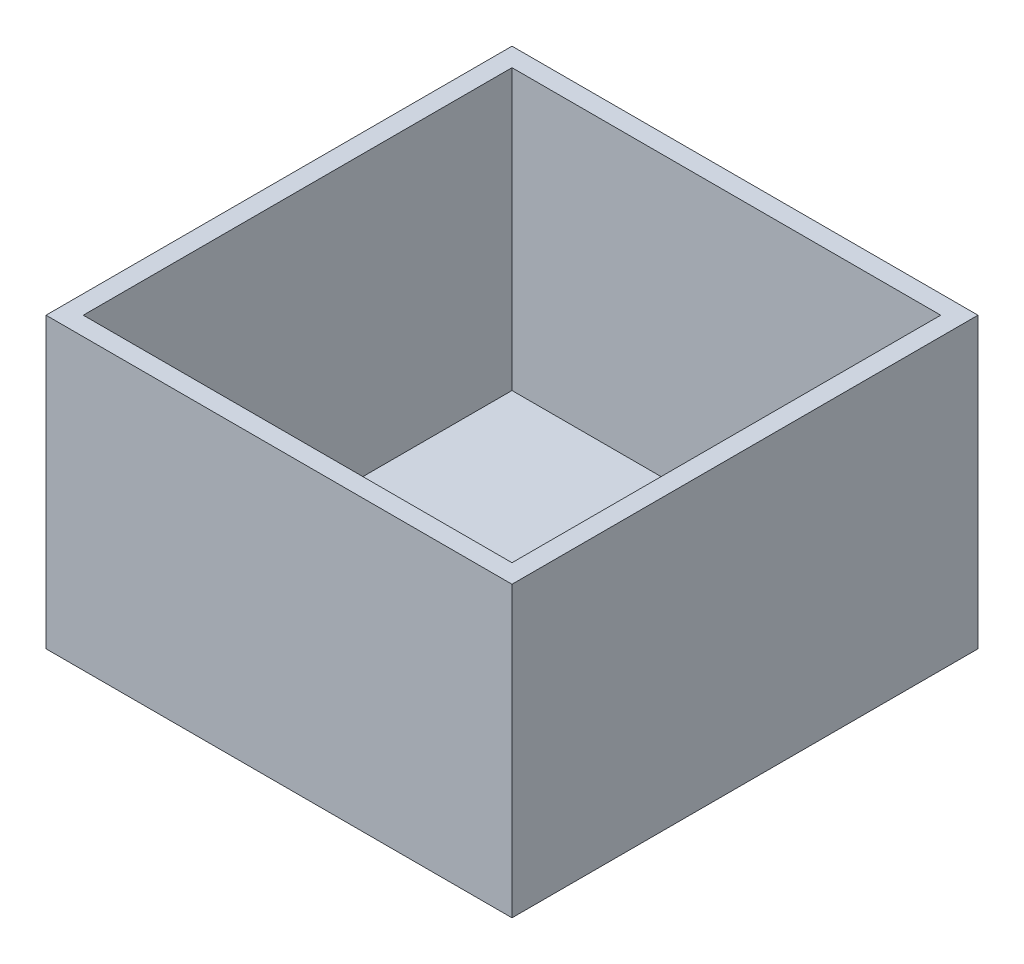
ISO-10303-21;
HEADER;
FILE_DESCRIPTION(('STEP AP214'),'2;1');
FILE_NAME('part.step','',(''),(''),'','','');
FILE_SCHEMA(('AUTOMOTIVE_DESIGN { 1 0 10303 214 1 1 1 1 }'));
ENDSEC;
DATA;
#1=APPLICATION_CONTEXT('core data for automotive mechanical design processes');
#2=APPLICATION_PROTOCOL_DEFINITION('international standard','automotive_design',2000,#1);
#3=PRODUCT_CONTEXT('',#1,'mechanical');
#4=PRODUCT('Part','Part','',(#3));
#5=PRODUCT_RELATED_PRODUCT_CATEGORY('part','',(#4));
#6=PRODUCT_DEFINITION_FORMATION('','',#4);
#7=PRODUCT_DEFINITION_CONTEXT('part definition',#1,'design');
#8=PRODUCT_DEFINITION('design','',#6,#7);
#9=PRODUCT_DEFINITION_SHAPE('','',#8);
#10=(LENGTH_UNIT() NAMED_UNIT(*) SI_UNIT(.MILLI.,.METRE.));
#11=(NAMED_UNIT(*) PLANE_ANGLE_UNIT() SI_UNIT($,.RADIAN.));
#12=(NAMED_UNIT(*) SI_UNIT($,.STERADIAN.) SOLID_ANGLE_UNIT());
#13=UNCERTAINTY_MEASURE_WITH_UNIT(LENGTH_MEASURE(1.E-05),#10,'distance_accuracy_value','');
#14=(GEOMETRIC_REPRESENTATION_CONTEXT(3) GLOBAL_UNCERTAINTY_ASSIGNED_CONTEXT((#13)) GLOBAL_UNIT_ASSIGNED_CONTEXT((#10,
#11,#12)) REPRESENTATION_CONTEXT('',''));
#15=CARTESIAN_POINT('',(0.,0.,0.));
#16=DIRECTION('',(0.,0.,1.));
#17=DIRECTION('',(1.,0.,0.));
#18=AXIS2_PLACEMENT_3D('',#15,#16,#17);
#19=CARTESIAN_POINT('',(0.,30.,0.));
#20=DIRECTION('',(0.,-1.,0.));
#21=DIRECTION('',(0.,0.,-1.));
#22=AXIS2_PLACEMENT_3D('',#19,#20,#21);
#23=PLANE('',#22);
#24=DIRECTION('',(0.,0.,-1.));
#25=VECTOR('',#24,1.);
#26=CARTESIAN_POINT('',(25.,30.,25.));
#27=LINE('',#26,#25);
#28=CARTESIAN_POINT('',(25.,30.,25.));
#29=VERTEX_POINT('',#28);
#30=CARTESIAN_POINT('',(25.,30.,-25.));
#31=VERTEX_POINT('',#30);
#32=EDGE_CURVE('E112',#29,#31,#27,.T.);
#33=ORIENTED_EDGE('',*,*,#32,.T.);
#34=DIRECTION('',(-1.,0.,0.));
#35=VECTOR('',#34,1.);
#36=CARTESIAN_POINT('',(-25.,30.,-25.));
#37=LINE('',#36,#35);
#38=CARTESIAN_POINT('',(-25.,30.,-25.));
#39=VERTEX_POINT('',#38);
#40=EDGE_CURVE('E161',#31,#39,#37,.T.);
#41=ORIENTED_EDGE('',*,*,#40,.T.);
#42=DIRECTION('',(0.,0.,1.));
#43=VECTOR('',#42,1.);
#44=CARTESIAN_POINT('',(-25.,30.,25.));
#45=LINE('',#44,#43);
#46=CARTESIAN_POINT('',(-25.,30.,25.));
#47=VERTEX_POINT('',#46);
#48=EDGE_CURVE('E163',#39,#47,#45,.T.);
#49=ORIENTED_EDGE('',*,*,#48,.T.);
#50=DIRECTION('',(1.,0.,0.));
#51=VECTOR('',#50,1.);
#52=CARTESIAN_POINT('',(-25.,30.,25.));
#53=LINE('',#52,#51);
#54=EDGE_CURVE('E116',#47,#29,#53,.T.);
#55=ORIENTED_EDGE('',*,*,#54,.T.);
#56=EDGE_LOOP('',(#33,#41,#49,#55));
#57=FACE_BOUND('',#56,.T.);
#58=DIRECTION('',(0.,0.,1.));
#59=VECTOR('',#58,1.);
#60=CARTESIAN_POINT('',(-23.,30.,23.));
#61=LINE('',#60,#59);
#62=CARTESIAN_POINT('',(-23.,30.,-23.));
#63=VERTEX_POINT('',#62);
#64=CARTESIAN_POINT('',(-23.,30.,23.));
#65=VERTEX_POINT('',#64);
#66=EDGE_CURVE('E135',#63,#65,#61,.T.);
#67=ORIENTED_EDGE('',*,*,#66,.F.);
#68=DIRECTION('',(-1.,0.,0.));
#69=VECTOR('',#68,1.);
#70=CARTESIAN_POINT('',(-23.,30.,-23.));
#71=LINE('',#70,#69);
#72=CARTESIAN_POINT('',(23.,30.,-23.));
#73=VERTEX_POINT('',#72);
#74=EDGE_CURVE('E142',#73,#63,#71,.T.);
#75=ORIENTED_EDGE('',*,*,#74,.F.);
#76=DIRECTION('',(0.,0.,-1.));
#77=VECTOR('',#76,1.);
#78=CARTESIAN_POINT('',(23.,30.,23.));
#79=LINE('',#78,#77);
#80=CARTESIAN_POINT('',(23.,30.,23.));
#81=VERTEX_POINT('',#80);
#82=EDGE_CURVE('E140',#81,#73,#79,.T.);
#83=ORIENTED_EDGE('',*,*,#82,.F.);
#84=DIRECTION('',(1.,0.,0.));
#85=VECTOR('',#84,1.);
#86=CARTESIAN_POINT('',(-23.,30.,23.));
#87=LINE('',#86,#85);
#88=EDGE_CURVE('E137',#65,#81,#87,.T.);
#89=ORIENTED_EDGE('',*,*,#88,.F.);
#90=EDGE_LOOP('',(#67,#75,#83,#89));
#91=FACE_BOUND('',#90,.T.);
#92=ADVANCED_FACE('F39',(#57,#91),#23,.F.);
#93=CARTESIAN_POINT('',(25.,30.,25.));
#94=DIRECTION('',(-1.,0.,0.));
#95=DIRECTION('',(0.,0.,1.));
#96=AXIS2_PLACEMENT_3D('',#93,#94,#95);
#97=PLANE('',#96);
#98=DIRECTION('',(0.,-1.,0.));
#99=VECTOR('',#98,1.);
#100=CARTESIAN_POINT('',(25.,30.,25.));
#101=LINE('',#100,#99);
#102=CARTESIAN_POINT('',(25.,-1.,25.));
#103=VERTEX_POINT('',#102);
#104=EDGE_CURVE('E106',#29,#103,#101,.T.);
#105=ORIENTED_EDGE('',*,*,#104,.T.);
#106=DIRECTION('',(0.,0.,1.));
#107=VECTOR('',#106,1.);
#108=CARTESIAN_POINT('',(25.,-1.,-25.));
#109=LINE('',#108,#107);
#110=CARTESIAN_POINT('',(25.,-1.,-25.));
#111=VERTEX_POINT('',#110);
#112=EDGE_CURVE('E110',#111,#103,#109,.T.);
#113=ORIENTED_EDGE('',*,*,#112,.F.);
#114=DIRECTION('',(0.,-1.,0.));
#115=VECTOR('',#114,1.);
#116=CARTESIAN_POINT('',(25.,30.,-25.));
#117=LINE('',#116,#115);
#118=EDGE_CURVE('E11',#31,#111,#117,.T.);
#119=ORIENTED_EDGE('',*,*,#118,.F.);
#120=ORIENTED_EDGE('',*,*,#32,.F.);
#121=EDGE_LOOP('',(#105,#113,#119,#120));
#122=FACE_BOUND('',#121,.T.);
#123=ADVANCED_FACE('F41',(#122),#97,.F.);
#124=CARTESIAN_POINT('',(-25.,30.,-25.));
#125=DIRECTION('',(0.,0.,1.));
#126=DIRECTION('',(1.,0.,0.));
#127=AXIS2_PLACEMENT_3D('',#124,#125,#126);
#128=PLANE('',#127);
#129=ORIENTED_EDGE('',*,*,#118,.T.);
#130=DIRECTION('',(1.,0.,0.));
#131=VECTOR('',#130,1.);
#132=CARTESIAN_POINT('',(-25.,-1.,-25.));
#133=LINE('',#132,#131);
#134=CARTESIAN_POINT('',(-25.,-1.,-25.));
#135=VERTEX_POINT('',#134);
#136=EDGE_CURVE('E130',#135,#111,#133,.T.);
#137=ORIENTED_EDGE('',*,*,#136,.F.);
#138=DIRECTION('',(0.,-1.,0.));
#139=VECTOR('',#138,1.);
#140=CARTESIAN_POINT('',(-25.,30.,-25.));
#141=LINE('',#140,#139);
#142=EDGE_CURVE('E47',#39,#135,#141,.T.);
#143=ORIENTED_EDGE('',*,*,#142,.F.);
#144=ORIENTED_EDGE('',*,*,#40,.F.);
#145=EDGE_LOOP('',(#129,#137,#143,#144));
#146=FACE_BOUND('',#145,.T.);
#147=ADVANCED_FACE('F171',(#146),#128,.F.);
#148=CARTESIAN_POINT('',(-25.,30.,25.));
#149=DIRECTION('',(1.,0.,0.));
#150=DIRECTION('',(0.,0.,-1.));
#151=AXIS2_PLACEMENT_3D('',#148,#149,#150);
#152=PLANE('',#151);
#153=ORIENTED_EDGE('',*,*,#142,.T.);
#154=DIRECTION('',(0.,0.,-1.));
#155=VECTOR('',#154,1.);
#156=CARTESIAN_POINT('',(-25.,-1.,-25.));
#157=LINE('',#156,#155);
#158=CARTESIAN_POINT('',(-25.,-1.,25.));
#159=VERTEX_POINT('',#158);
#160=EDGE_CURVE('E125',#159,#135,#157,.T.);
#161=ORIENTED_EDGE('',*,*,#160,.F.);
#162=DIRECTION('',(0.,-1.,0.));
#163=VECTOR('',#162,1.);
#164=CARTESIAN_POINT('',(-25.,30.,25.));
#165=LINE('',#164,#163);
#166=EDGE_CURVE('E115',#47,#159,#165,.T.);
#167=ORIENTED_EDGE('',*,*,#166,.F.);
#168=ORIENTED_EDGE('',*,*,#48,.F.);
#169=EDGE_LOOP('',(#153,#161,#167,#168));
#170=FACE_BOUND('',#169,.T.);
#171=ADVANCED_FACE('F169',(#170),#152,.F.);
#172=CARTESIAN_POINT('',(-25.,30.,25.));
#173=DIRECTION('',(0.,0.,-1.));
#174=DIRECTION('',(-1.,0.,0.));
#175=AXIS2_PLACEMENT_3D('',#172,#173,#174);
#176=PLANE('',#175);
#177=ORIENTED_EDGE('',*,*,#166,.T.);
#178=DIRECTION('',(-1.,0.,0.));
#179=VECTOR('',#178,1.);
#180=CARTESIAN_POINT('',(-25.,-1.,25.));
#181=LINE('',#180,#179);
#182=EDGE_CURVE('E119',#103,#159,#181,.T.);
#183=ORIENTED_EDGE('',*,*,#182,.F.);
#184=ORIENTED_EDGE('',*,*,#104,.F.);
#185=ORIENTED_EDGE('',*,*,#54,.F.);
#186=EDGE_LOOP('',(#177,#183,#184,#185));
#187=FACE_BOUND('',#186,.T.);
#188=ADVANCED_FACE('F120',(#187),#176,.F.);
#189=CARTESIAN_POINT('',(-23.,30.,23.));
#190=DIRECTION('',(1.,0.,0.));
#191=DIRECTION('',(0.,0.,-1.));
#192=AXIS2_PLACEMENT_3D('',#189,#190,#191);
#193=PLANE('',#192);
#194=DIRECTION('',(0.,0.,1.));
#195=VECTOR('',#194,1.);
#196=CARTESIAN_POINT('',(-23.,0.,23.));
#197=LINE('',#196,#195);
#198=CARTESIAN_POINT('',(-23.,0.,-23.));
#199=VERTEX_POINT('',#198);
#200=CARTESIAN_POINT('',(-23.,0.,23.));
#201=VERTEX_POINT('',#200);
#202=EDGE_CURVE('E62',#199,#201,#197,.T.);
#203=ORIENTED_EDGE('',*,*,#202,.F.);
#204=DIRECTION('',(0.,-1.,0.));
#205=VECTOR('',#204,1.);
#206=CARTESIAN_POINT('',(-23.,30.,-23.));
#207=LINE('',#206,#205);
#208=EDGE_CURVE('E144',#63,#199,#207,.T.);
#209=ORIENTED_EDGE('',*,*,#208,.F.);
#210=ORIENTED_EDGE('',*,*,#66,.T.);
#211=DIRECTION('',(0.,-1.,0.));
#212=VECTOR('',#211,1.);
#213=CARTESIAN_POINT('',(-23.,30.,23.));
#214=LINE('',#213,#212);
#215=EDGE_CURVE('E158',#65,#201,#214,.T.);
#216=ORIENTED_EDGE('',*,*,#215,.T.);
#217=EDGE_LOOP('',(#203,#209,#210,#216));
#218=FACE_BOUND('',#217,.T.);
#219=ADVANCED_FACE('F181',(#218),#193,.T.);
#220=CARTESIAN_POINT('',(-23.,30.,23.));
#221=DIRECTION('',(0.,0.,-1.));
#222=DIRECTION('',(-1.,0.,0.));
#223=AXIS2_PLACEMENT_3D('',#220,#221,#222);
#224=PLANE('',#223);
#225=DIRECTION('',(1.,0.,0.));
#226=VECTOR('',#225,1.);
#227=CARTESIAN_POINT('',(-23.,0.,23.));
#228=LINE('',#227,#226);
#229=CARTESIAN_POINT('',(23.,0.,23.));
#230=VERTEX_POINT('',#229);
#231=EDGE_CURVE('E146',#201,#230,#228,.T.);
#232=ORIENTED_EDGE('',*,*,#231,.F.);
#233=ORIENTED_EDGE('',*,*,#215,.F.);
#234=ORIENTED_EDGE('',*,*,#88,.T.);
#235=DIRECTION('',(0.,-1.,0.));
#236=VECTOR('',#235,1.);
#237=CARTESIAN_POINT('',(23.,30.,23.));
#238=LINE('',#237,#236);
#239=EDGE_CURVE('E156',#81,#230,#238,.T.);
#240=ORIENTED_EDGE('',*,*,#239,.T.);
#241=EDGE_LOOP('',(#232,#233,#234,#240));
#242=FACE_BOUND('',#241,.T.);
#243=ADVANCED_FACE('F183',(#242),#224,.T.);
#244=CARTESIAN_POINT('',(23.,30.,23.));
#245=DIRECTION('',(-1.,0.,0.));
#246=DIRECTION('',(0.,0.,1.));
#247=AXIS2_PLACEMENT_3D('',#244,#245,#246);
#248=PLANE('',#247);
#249=DIRECTION('',(0.,0.,-1.));
#250=VECTOR('',#249,1.);
#251=CARTESIAN_POINT('',(23.,0.,23.));
#252=LINE('',#251,#250);
#253=CARTESIAN_POINT('',(23.,0.,-23.));
#254=VERTEX_POINT('',#253);
#255=EDGE_CURVE('E149',#230,#254,#252,.T.);
#256=ORIENTED_EDGE('',*,*,#255,.F.);
#257=ORIENTED_EDGE('',*,*,#239,.F.);
#258=ORIENTED_EDGE('',*,*,#82,.T.);
#259=DIRECTION('',(0.,-1.,0.));
#260=VECTOR('',#259,1.);
#261=CARTESIAN_POINT('',(23.,30.,-23.));
#262=LINE('',#261,#260);
#263=EDGE_CURVE('E54',#73,#254,#262,.T.);
#264=ORIENTED_EDGE('',*,*,#263,.T.);
#265=EDGE_LOOP('',(#256,#257,#258,#264));
#266=FACE_BOUND('',#265,.T.);
#267=ADVANCED_FACE('F190',(#266),#248,.T.);
#268=CARTESIAN_POINT('',(-23.,30.,-23.));
#269=DIRECTION('',(0.,0.,1.));
#270=DIRECTION('',(1.,0.,0.));
#271=AXIS2_PLACEMENT_3D('',#268,#269,#270);
#272=PLANE('',#271);
#273=DIRECTION('',(-1.,0.,0.));
#274=VECTOR('',#273,1.);
#275=CARTESIAN_POINT('',(-23.,0.,-23.));
#276=LINE('',#275,#274);
#277=EDGE_CURVE('E138',#254,#199,#276,.T.);
#278=ORIENTED_EDGE('',*,*,#277,.F.);
#279=ORIENTED_EDGE('',*,*,#263,.F.);
#280=ORIENTED_EDGE('',*,*,#74,.T.);
#281=ORIENTED_EDGE('',*,*,#208,.T.);
#282=EDGE_LOOP('',(#278,#279,#280,#281));
#283=FACE_BOUND('',#282,.T.);
#284=ADVANCED_FACE('F188',(#283),#272,.T.);
#285=CARTESIAN_POINT('',(0.,0.,0.));
#286=DIRECTION('',(0.,1.,0.));
#287=DIRECTION('',(0.,0.,1.));
#288=AXIS2_PLACEMENT_3D('',#285,#286,#287);
#289=PLANE('',#288);
#290=ORIENTED_EDGE('',*,*,#255,.T.);
#291=ORIENTED_EDGE('',*,*,#277,.T.);
#292=ORIENTED_EDGE('',*,*,#202,.T.);
#293=ORIENTED_EDGE('',*,*,#231,.T.);
#294=EDGE_LOOP('',(#290,#291,#292,#293));
#295=FACE_BOUND('',#294,.T.);
#296=ADVANCED_FACE('F187',(#295),#289,.T.);
#297=CARTESIAN_POINT('',(0.,-1.,0.));
#298=DIRECTION('',(0.,1.,0.));
#299=DIRECTION('',(0.,0.,1.));
#300=AXIS2_PLACEMENT_3D('',#297,#298,#299);
#301=PLANE('',#300);
#302=ORIENTED_EDGE('',*,*,#112,.T.);
#303=ORIENTED_EDGE('',*,*,#182,.T.);
#304=ORIENTED_EDGE('',*,*,#160,.T.);
#305=ORIENTED_EDGE('',*,*,#136,.T.);
#306=EDGE_LOOP('',(#302,#303,#304,#305));
#307=FACE_BOUND('',#306,.T.);
#308=ADVANCED_FACE('F128',(#307),#301,.F.);
#309=CLOSED_SHELL('',(#92,#123,#147,#171,#188,#219,#243,#267,#284,#296,#308));
#310=MANIFOLD_SOLID_BREP('B2',#309);
#311=ADVANCED_BREP_SHAPE_REPRESENTATION('',(#18,#310),#14);
#312=SHAPE_DEFINITION_REPRESENTATION(#9,#311);
ENDSEC;
END-ISO-10303-21;
